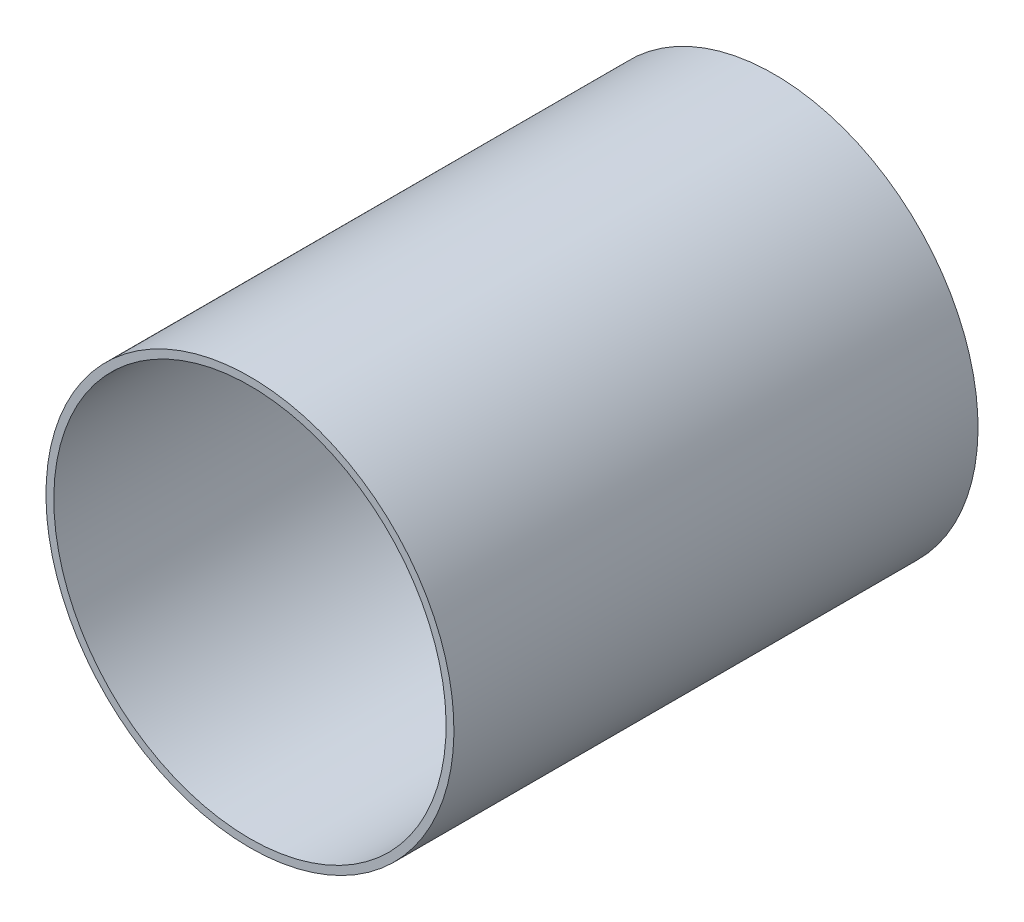
ISO-10303-21;
HEADER;
FILE_DESCRIPTION(('STEP AP214'),'2;1');
FILE_NAME('part.step','',(''),(''),'','','');
FILE_SCHEMA(('AUTOMOTIVE_DESIGN { 1 0 10303 214 1 1 1 1 }'));
ENDSEC;
DATA;
#1=APPLICATION_CONTEXT('core data for automotive mechanical design processes');
#2=APPLICATION_PROTOCOL_DEFINITION('international standard','automotive_design',2000,#1);
#3=PRODUCT_CONTEXT('',#1,'mechanical');
#4=PRODUCT('Part','Part','',(#3));
#5=PRODUCT_RELATED_PRODUCT_CATEGORY('part','',(#4));
#6=PRODUCT_DEFINITION_FORMATION('','',#4);
#7=PRODUCT_DEFINITION_CONTEXT('part definition',#1,'design');
#8=PRODUCT_DEFINITION('design','',#6,#7);
#9=PRODUCT_DEFINITION_SHAPE('','',#8);
#10=(LENGTH_UNIT() NAMED_UNIT(*) SI_UNIT(.MILLI.,.METRE.));
#11=(NAMED_UNIT(*) PLANE_ANGLE_UNIT() SI_UNIT($,.RADIAN.));
#12=(NAMED_UNIT(*) SI_UNIT($,.STERADIAN.) SOLID_ANGLE_UNIT());
#13=UNCERTAINTY_MEASURE_WITH_UNIT(LENGTH_MEASURE(1.E-05),#10,'distance_accuracy_value','');
#14=(GEOMETRIC_REPRESENTATION_CONTEXT(3) GLOBAL_UNCERTAINTY_ASSIGNED_CONTEXT((#13)) GLOBAL_UNIT_ASSIGNED_CONTEXT((#10,
#11,#12)) REPRESENTATION_CONTEXT('',''));
#15=CARTESIAN_POINT('',(0.,0.,0.));
#16=DIRECTION('',(0.,0.,1.));
#17=DIRECTION('',(1.,0.,0.));
#18=AXIS2_PLACEMENT_3D('',#15,#16,#17);
#19=CARTESIAN_POINT('',(79.99,-84.59,-0.045));
#20=DIRECTION('',(0.,0.,-1.));
#21=DIRECTION('',(0.,-1.,0.));
#22=AXIS2_PLACEMENT_3D('',#19,#20,#21);
#23=CYLINDRICAL_SURFACE('',#22,0.625);
#24=CARTESIAN_POINT('',(79.99,-84.59,-0.035));
#25=DIRECTION('',(0.,0.,-1.));
#26=DIRECTION('',(0.,-1.,0.));
#27=AXIS2_PLACEMENT_3D('',#24,#25,#26);
#28=CIRCLE('',#27,0.625);
#29=CARTESIAN_POINT('',(79.99,-85.215,-0.035));
#30=VERTEX_POINT('',#29);
#31=EDGE_CURVE('E64',#30,#30,#28,.T.);
#32=ORIENTED_EDGE('',*,*,#31,.T.);
#33=DIRECTION('',(0.,0.,1.));
#34=VECTOR('',#33,1.);
#35=CARTESIAN_POINT('',(79.99,-85.215,-0.045));
#36=LINE('',#35,#34);
#37=CARTESIAN_POINT('',(79.99,-85.215,1.635));
#38=VERTEX_POINT('',#37);
#39=EDGE_CURVE('E11',#30,#38,#36,.T.);
#40=ORIENTED_EDGE('',*,*,#39,.T.);
#41=CARTESIAN_POINT('',(79.99,-84.59,1.635));
#42=DIRECTION('',(0.,0.,-1.));
#43=DIRECTION('',(0.,-1.,0.));
#44=AXIS2_PLACEMENT_3D('',#41,#42,#43);
#45=CIRCLE('',#44,0.625);
#46=EDGE_CURVE('E25',#38,#38,#45,.T.);
#47=ORIENTED_EDGE('',*,*,#46,.F.);
#48=ORIENTED_EDGE('',*,*,#39,.F.);
#49=EDGE_LOOP('',(#32,#40,#47,#48));
#50=FACE_BOUND('',#49,.T.);
#51=ADVANCED_FACE('F17',(#50),#23,.F.);
#52=CARTESIAN_POINT('',(79.99,-85.24,1.635));
#53=DIRECTION('',(0.,0.,1.));
#54=DIRECTION('',(1.,0.,0.));
#55=AXIS2_PLACEMENT_3D('',#52,#53,#54);
#56=PLANE('',#55);
#57=ORIENTED_EDGE('',*,*,#46,.T.);
#58=EDGE_LOOP('',(#57));
#59=FACE_BOUND('',#58,.T.);
#60=CARTESIAN_POINT('',(79.99,-84.59,1.635));
#61=DIRECTION('',(0.,0.,1.));
#62=DIRECTION('',(0.,-1.,0.));
#63=AXIS2_PLACEMENT_3D('',#60,#61,#62);
#64=CIRCLE('',#63,0.65);
#65=CARTESIAN_POINT('',(79.99,-85.24,1.635));
#66=VERTEX_POINT('',#65);
#67=EDGE_CURVE('E56',#66,#66,#64,.T.);
#68=ORIENTED_EDGE('',*,*,#67,.T.);
#69=EDGE_LOOP('',(#68));
#70=FACE_BOUND('',#69,.T.);
#71=ADVANCED_FACE('F73',(#59,#70),#56,.T.);
#72=CARTESIAN_POINT('',(79.99,-85.24,-0.035));
#73=DIRECTION('',(0.,0.,1.));
#74=DIRECTION('',(1.,0.,0.));
#75=AXIS2_PLACEMENT_3D('',#72,#73,#74);
#76=PLANE('',#75);
#77=ORIENTED_EDGE('',*,*,#31,.F.);
#78=EDGE_LOOP('',(#77));
#79=FACE_BOUND('',#78,.T.);
#80=CARTESIAN_POINT('',(79.99,-84.59,-0.035));
#81=DIRECTION('',(0.,0.,1.));
#82=DIRECTION('',(0.,-1.,0.));
#83=AXIS2_PLACEMENT_3D('',#80,#81,#82);
#84=CIRCLE('',#83,0.65);
#85=CARTESIAN_POINT('',(79.99,-85.24,-0.035));
#86=VERTEX_POINT('',#85);
#87=EDGE_CURVE('E55',#86,#86,#84,.T.);
#88=ORIENTED_EDGE('',*,*,#87,.F.);
#89=EDGE_LOOP('',(#88));
#90=FACE_BOUND('',#89,.T.);
#91=ADVANCED_FACE('F82',(#79,#90),#76,.F.);
#92=CARTESIAN_POINT('',(79.99,-84.59,-0.035));
#93=DIRECTION('',(0.,0.,-1.));
#94=DIRECTION('',(0.,-1.,0.));
#95=AXIS2_PLACEMENT_3D('',#92,#93,#94);
#96=CYLINDRICAL_SURFACE('',#95,0.65);
#97=ORIENTED_EDGE('',*,*,#87,.T.);
#98=DIRECTION('',(0.,0.,1.));
#99=VECTOR('',#98,1.);
#100=CARTESIAN_POINT('',(79.99,-85.24,-0.035));
#101=LINE('',#100,#99);
#102=EDGE_CURVE('E52',#86,#66,#101,.T.);
#103=ORIENTED_EDGE('',*,*,#102,.T.);
#104=ORIENTED_EDGE('',*,*,#67,.F.);
#105=ORIENTED_EDGE('',*,*,#102,.F.);
#106=EDGE_LOOP('',(#97,#103,#104,#105));
#107=FACE_BOUND('',#106,.T.);
#108=ADVANCED_FACE('F53',(#107),#96,.T.);
#109=CLOSED_SHELL('',(#51,#71,#91,#108));
#110=MANIFOLD_SOLID_BREP('B1',#109);
#111=ADVANCED_BREP_SHAPE_REPRESENTATION('',(#18,#110),#14);
#112=SHAPE_DEFINITION_REPRESENTATION(#9,#111);
ENDSEC;
END-ISO-10303-21;
